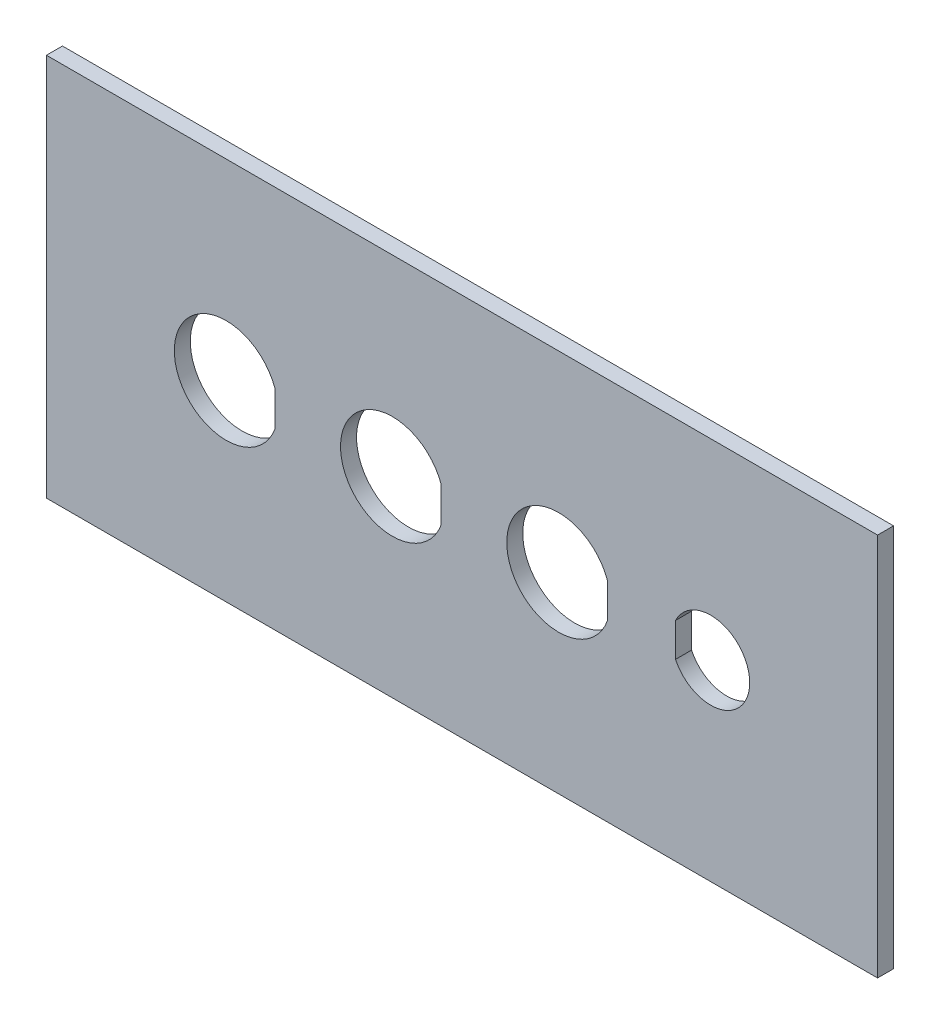
ISO-10303-21;
HEADER;
FILE_DESCRIPTION(('STEP AP214'),'2;1');
FILE_NAME('part.step','',(''),(''),'','','');
FILE_SCHEMA(('AUTOMOTIVE_DESIGN { 1 0 10303 214 1 1 1 1 }'));
ENDSEC;
DATA;
#1=APPLICATION_CONTEXT('core data for automotive mechanical design processes');
#2=APPLICATION_PROTOCOL_DEFINITION('international standard','automotive_design',2000,#1);
#3=PRODUCT_CONTEXT('',#1,'mechanical');
#4=PRODUCT('Part','Part','',(#3));
#5=PRODUCT_RELATED_PRODUCT_CATEGORY('part','',(#4));
#6=PRODUCT_DEFINITION_FORMATION('','',#4);
#7=PRODUCT_DEFINITION_CONTEXT('part definition',#1,'design');
#8=PRODUCT_DEFINITION('design','',#6,#7);
#9=PRODUCT_DEFINITION_SHAPE('','',#8);
#10=(LENGTH_UNIT() NAMED_UNIT(*) SI_UNIT(.MILLI.,.METRE.));
#11=(NAMED_UNIT(*) PLANE_ANGLE_UNIT() SI_UNIT($,.RADIAN.));
#12=(NAMED_UNIT(*) SI_UNIT($,.STERADIAN.) SOLID_ANGLE_UNIT());
#13=UNCERTAINTY_MEASURE_WITH_UNIT(LENGTH_MEASURE(1.E-05),#10,'distance_accuracy_value','');
#14=(GEOMETRIC_REPRESENTATION_CONTEXT(3) GLOBAL_UNCERTAINTY_ASSIGNED_CONTEXT((#13)) GLOBAL_UNIT_ASSIGNED_CONTEXT((#10,
#11,#12)) REPRESENTATION_CONTEXT('',''));
#15=CARTESIAN_POINT('',(0.,0.,0.));
#16=DIRECTION('',(0.,0.,1.));
#17=DIRECTION('',(1.,0.,0.));
#18=AXIS2_PLACEMENT_3D('',#15,#16,#17);
#19=CARTESIAN_POINT('',(0.,0.,3.175));
#20=DIRECTION('',(0.,0.,1.));
#21=DIRECTION('',(1.,0.,0.));
#22=AXIS2_PLACEMENT_3D('',#19,#20,#21);
#23=PLANE('',#22);
#24=DIRECTION('',(0.,1.,0.));
#25=VECTOR('',#24,1.);
#26=CARTESIAN_POINT('',(91.9011726957601,37.6066565431627,3.175));
#27=LINE('',#26,#25);
#28=CARTESIAN_POINT('',(91.9011726957601,-38.5933434568373,3.175));
#29=VERTEX_POINT('',#28);
#30=CARTESIAN_POINT('',(91.9011726957601,37.6066565431627,3.175));
#31=VERTEX_POINT('',#30);
#32=EDGE_CURVE('E241',#29,#31,#27,.T.);
#33=ORIENTED_EDGE('',*,*,#32,.T.);
#34=DIRECTION('',(-1.,0.,0.));
#35=VECTOR('',#34,1.);
#36=CARTESIAN_POINT('',(-73.1988273042399,37.6066565431627,3.175));
#37=LINE('',#36,#35);
#38=CARTESIAN_POINT('',(-73.1988273042399,37.6066565431627,3.175));
#39=VERTEX_POINT('',#38);
#40=EDGE_CURVE('E245',#31,#39,#37,.T.);
#41=ORIENTED_EDGE('',*,*,#40,.T.);
#42=DIRECTION('',(0.,-1.,0.));
#43=VECTOR('',#42,1.);
#44=CARTESIAN_POINT('',(-73.1988273042399,37.6066565431627,3.175));
#45=LINE('',#44,#43);
#46=CARTESIAN_POINT('',(-73.1988273042399,-38.5933434568373,3.175));
#47=VERTEX_POINT('',#46);
#48=EDGE_CURVE('E249',#39,#47,#45,.T.);
#49=ORIENTED_EDGE('',*,*,#48,.T.);
#50=DIRECTION('',(1.,0.,0.));
#51=VECTOR('',#50,1.);
#52=CARTESIAN_POINT('',(-73.1988273042399,-38.5933434568373,3.175));
#53=LINE('',#52,#51);
#54=EDGE_CURVE('E252',#47,#29,#53,.T.);
#55=ORIENTED_EDGE('',*,*,#54,.T.);
#56=EDGE_LOOP('',(#33,#41,#49,#55));
#57=FACE_BOUND('',#56,.T.);
#58=DIRECTION('',(0.,1.,0.));
#59=VECTOR('',#58,1.);
#60=CARTESIAN_POINT('',(-27.7988273042399,2.97075815830049,3.175));
#61=LINE('',#60,#59);
#62=CARTESIAN_POINT('',(-27.7988273042399,-3.95744507197501,3.175));
#63=VERTEX_POINT('',#62);
#64=CARTESIAN_POINT('',(-27.7988273042399,2.97075815830049,3.175));
#65=VERTEX_POINT('',#64);
#66=EDGE_CURVE('E222',#63,#65,#61,.T.);
#67=ORIENTED_EDGE('',*,*,#66,.F.);
#68=CARTESIAN_POINT('',(-37.4988273042399,-0.493343456837263,3.175));
#69=DIRECTION('',(0.,0.,1.));
#70=DIRECTION('',(1.,0.,0.));
#71=AXIS2_PLACEMENT_3D('',#68,#69,#70);
#72=CIRCLE('',#71,10.3);
#73=EDGE_CURVE('E219',#65,#63,#72,.T.);
#74=ORIENTED_EDGE('',*,*,#73,.F.);
#75=EDGE_LOOP('',(#67,#74));
#76=FACE_BOUND('',#75,.T.);
#77=DIRECTION('',(0.,-1.,0.));
#78=VECTOR('',#77,1.);
#79=CARTESIAN_POINT('',(51.7691726957601,2.85714665656408,3.175));
#80=LINE('',#79,#78);
#81=CARTESIAN_POINT('',(51.7691726957601,2.85714665656408,3.175));
#82=VERTEX_POINT('',#81);
#83=CARTESIAN_POINT('',(51.7691726957601,-3.84383357023861,3.175));
#84=VERTEX_POINT('',#83);
#85=EDGE_CURVE('E200',#82,#84,#80,.T.);
#86=ORIENTED_EDGE('',*,*,#85,.F.);
#87=CARTESIAN_POINT('',(58.7541726957601,-0.493343456837263,3.175));
#88=DIRECTION('',(0.,0.,1.));
#89=DIRECTION('',(1.,0.,0.));
#90=AXIS2_PLACEMENT_3D('',#87,#88,#89);
#91=CIRCLE('',#90,7.747);
#92=EDGE_CURVE('E196',#84,#82,#91,.T.);
#93=ORIENTED_EDGE('',*,*,#92,.F.);
#94=EDGE_LOOP('',(#86,#93));
#95=FACE_BOUND('',#94,.T.);
#96=DIRECTION('',(0.,1.,0.));
#97=VECTOR('',#96,1.);
#98=CARTESIAN_POINT('',(5.22117269576011,2.97075815830049,3.175));
#99=LINE('',#98,#97);
#100=CARTESIAN_POINT('',(5.22117269576011,-3.95744507197501,3.175));
#101=VERTEX_POINT('',#100);
#102=CARTESIAN_POINT('',(5.22117269576011,2.97075815830049,3.175));
#103=VERTEX_POINT('',#102);
#104=EDGE_CURVE('E177',#101,#103,#99,.T.);
#105=ORIENTED_EDGE('',*,*,#104,.F.);
#106=CARTESIAN_POINT('',(-4.47882730423989,-0.493343456837263,3.175));
#107=DIRECTION('',(0.,0.,1.));
#108=DIRECTION('',(1.,0.,0.));
#109=AXIS2_PLACEMENT_3D('',#106,#107,#108);
#110=CIRCLE('',#109,10.3);
#111=EDGE_CURVE('E173',#103,#101,#110,.T.);
#112=ORIENTED_EDGE('',*,*,#111,.F.);
#113=EDGE_LOOP('',(#105,#112));
#114=FACE_BOUND('',#113,.T.);
#115=DIRECTION('',(0.,1.,0.));
#116=VECTOR('',#115,1.);
#117=CARTESIAN_POINT('',(38.2411726957601,2.97075815830049,3.175));
#118=LINE('',#117,#116);
#119=CARTESIAN_POINT('',(38.2411726957601,-3.95744507197501,3.175));
#120=VERTEX_POINT('',#119);
#121=CARTESIAN_POINT('',(38.2411726957601,2.97075815830049,3.175));
#122=VERTEX_POINT('',#121);
#123=EDGE_CURVE('E149',#120,#122,#118,.T.);
#124=ORIENTED_EDGE('',*,*,#123,.F.);
#125=CARTESIAN_POINT('',(28.5411726957601,-0.493343456837263,3.175));
#126=DIRECTION('',(0.,0.,1.));
#127=DIRECTION('',(1.,0.,0.));
#128=AXIS2_PLACEMENT_3D('',#125,#126,#127);
#129=CIRCLE('',#128,10.3);
#130=EDGE_CURVE('E156',#122,#120,#129,.T.);
#131=ORIENTED_EDGE('',*,*,#130,.F.);
#132=EDGE_LOOP('',(#124,#131));
#133=FACE_BOUND('',#132,.T.);
#134=ADVANCED_FACE('F43',(#57,#76,#95,#114,#133),#23,.T.);
#135=CARTESIAN_POINT('',(0.,0.,0.));
#136=DIRECTION('',(0.,0.,1.));
#137=DIRECTION('',(1.,0.,0.));
#138=AXIS2_PLACEMENT_3D('',#135,#136,#137);
#139=PLANE('',#138);
#140=CARTESIAN_POINT('',(-4.47882730423989,-0.493343456837263,0.));
#141=DIRECTION('',(0.,0.,1.));
#142=DIRECTION('',(1.,0.,0.));
#143=AXIS2_PLACEMENT_3D('',#140,#141,#142);
#144=CIRCLE('',#143,10.3);
#145=CARTESIAN_POINT('',(5.22117269576011,2.97075815830049,0.));
#146=VERTEX_POINT('',#145);
#147=CARTESIAN_POINT('',(5.22117269576011,-3.95744507197501,0.));
#148=VERTEX_POINT('',#147);
#149=EDGE_CURVE('E172',#146,#148,#144,.T.);
#150=ORIENTED_EDGE('',*,*,#149,.T.);
#151=DIRECTION('',(0.,1.,0.));
#152=VECTOR('',#151,1.);
#153=CARTESIAN_POINT('',(5.22117269576011,2.97075815830049,0.));
#154=LINE('',#153,#152);
#155=EDGE_CURVE('E178',#148,#146,#154,.T.);
#156=ORIENTED_EDGE('',*,*,#155,.T.);
#157=EDGE_LOOP('',(#150,#156));
#158=FACE_BOUND('',#157,.T.);
#159=CARTESIAN_POINT('',(-37.4988273042399,-0.493343456837263,0.));
#160=DIRECTION('',(0.,0.,1.));
#161=DIRECTION('',(1.,0.,0.));
#162=AXIS2_PLACEMENT_3D('',#159,#160,#161);
#163=CIRCLE('',#162,10.3);
#164=CARTESIAN_POINT('',(-27.7988273042399,2.97075815830049,0.));
#165=VERTEX_POINT('',#164);
#166=CARTESIAN_POINT('',(-27.7988273042399,-3.95744507197501,0.));
#167=VERTEX_POINT('',#166);
#168=EDGE_CURVE('E218',#165,#167,#163,.T.);
#169=ORIENTED_EDGE('',*,*,#168,.T.);
#170=DIRECTION('',(0.,1.,0.));
#171=VECTOR('',#170,1.);
#172=CARTESIAN_POINT('',(-27.7988273042399,2.97075815830049,0.));
#173=LINE('',#172,#171);
#174=EDGE_CURVE('E223',#167,#165,#173,.T.);
#175=ORIENTED_EDGE('',*,*,#174,.T.);
#176=EDGE_LOOP('',(#169,#175));
#177=FACE_BOUND('',#176,.T.);
#178=DIRECTION('',(0.,1.,0.));
#179=VECTOR('',#178,1.);
#180=CARTESIAN_POINT('',(91.9011726957601,37.6066565431627,0.));
#181=LINE('',#180,#179);
#182=CARTESIAN_POINT('',(91.9011726957601,-38.5933434568373,0.));
#183=VERTEX_POINT('',#182);
#184=CARTESIAN_POINT('',(91.9011726957601,37.6066565431627,0.));
#185=VERTEX_POINT('',#184);
#186=EDGE_CURVE('E240',#183,#185,#181,.T.);
#187=ORIENTED_EDGE('',*,*,#186,.F.);
#188=DIRECTION('',(1.,0.,0.));
#189=VECTOR('',#188,1.);
#190=CARTESIAN_POINT('',(-73.1988273042399,-38.5933434568373,0.));
#191=LINE('',#190,#189);
#192=CARTESIAN_POINT('',(-73.1988273042399,-38.5933434568373,0.));
#193=VERTEX_POINT('',#192);
#194=EDGE_CURVE('E246',#193,#183,#191,.T.);
#195=ORIENTED_EDGE('',*,*,#194,.F.);
#196=DIRECTION('',(0.,-1.,0.));
#197=VECTOR('',#196,1.);
#198=CARTESIAN_POINT('',(-73.1988273042399,37.6066565431627,0.));
#199=LINE('',#198,#197);
#200=CARTESIAN_POINT('',(-73.1988273042399,37.6066565431627,0.));
#201=VERTEX_POINT('',#200);
#202=EDGE_CURVE('E262',#201,#193,#199,.T.);
#203=ORIENTED_EDGE('',*,*,#202,.F.);
#204=DIRECTION('',(-1.,0.,0.));
#205=VECTOR('',#204,1.);
#206=CARTESIAN_POINT('',(-73.1988273042399,37.6066565431627,0.));
#207=LINE('',#206,#205);
#208=EDGE_CURVE('E259',#185,#201,#207,.T.);
#209=ORIENTED_EDGE('',*,*,#208,.F.);
#210=EDGE_LOOP('',(#187,#195,#203,#209));
#211=FACE_BOUND('',#210,.T.);
#212=CARTESIAN_POINT('',(58.7541726957601,-0.493343456837263,0.));
#213=DIRECTION('',(0.,0.,1.));
#214=DIRECTION('',(1.,0.,0.));
#215=AXIS2_PLACEMENT_3D('',#212,#213,#214);
#216=CIRCLE('',#215,7.747);
#217=CARTESIAN_POINT('',(51.7691726957601,-3.84383357023861,0.));
#218=VERTEX_POINT('',#217);
#219=CARTESIAN_POINT('',(51.7691726957601,2.85714665656408,0.));
#220=VERTEX_POINT('',#219);
#221=EDGE_CURVE('E195',#218,#220,#216,.T.);
#222=ORIENTED_EDGE('',*,*,#221,.T.);
#223=DIRECTION('',(0.,-1.,0.));
#224=VECTOR('',#223,1.);
#225=CARTESIAN_POINT('',(51.7691726957601,2.85714665656408,0.));
#226=LINE('',#225,#224);
#227=EDGE_CURVE('E201',#220,#218,#226,.T.);
#228=ORIENTED_EDGE('',*,*,#227,.T.);
#229=EDGE_LOOP('',(#222,#228));
#230=FACE_BOUND('',#229,.T.);
#231=CARTESIAN_POINT('',(28.5411726957601,-0.493343456837263,0.));
#232=DIRECTION('',(0.,0.,1.));
#233=DIRECTION('',(1.,0.,0.));
#234=AXIS2_PLACEMENT_3D('',#231,#232,#233);
#235=CIRCLE('',#234,10.3);
#236=CARTESIAN_POINT('',(38.2411726957601,2.97075815830049,0.));
#237=VERTEX_POINT('',#236);
#238=CARTESIAN_POINT('',(38.2411726957601,-3.95744507197501,0.));
#239=VERTEX_POINT('',#238);
#240=EDGE_CURVE('E71',#237,#239,#235,.T.);
#241=ORIENTED_EDGE('',*,*,#240,.T.);
#242=DIRECTION('',(0.,1.,0.));
#243=VECTOR('',#242,1.);
#244=CARTESIAN_POINT('',(38.2411726957601,2.97075815830049,0.));
#245=LINE('',#244,#243);
#246=EDGE_CURVE('E162',#239,#237,#245,.T.);
#247=ORIENTED_EDGE('',*,*,#246,.T.);
#248=EDGE_LOOP('',(#241,#247));
#249=FACE_BOUND('',#248,.T.);
#250=ADVANCED_FACE('F283',(#158,#177,#211,#230,#249),#139,.F.);
#251=CARTESIAN_POINT('',(91.9011726957601,37.6066565431627,3.175));
#252=DIRECTION('',(-1.,0.,0.));
#253=DIRECTION('',(0.,0.,1.));
#254=AXIS2_PLACEMENT_3D('',#251,#252,#253);
#255=PLANE('',#254);
#256=ORIENTED_EDGE('',*,*,#186,.T.);
#257=DIRECTION('',(0.,0.,-1.));
#258=VECTOR('',#257,1.);
#259=CARTESIAN_POINT('',(91.9011726957601,37.6066565431627,3.175));
#260=LINE('',#259,#258);
#261=EDGE_CURVE('E11',#31,#185,#260,.T.);
#262=ORIENTED_EDGE('',*,*,#261,.F.);
#263=ORIENTED_EDGE('',*,*,#32,.F.);
#264=DIRECTION('',(0.,0.,-1.));
#265=VECTOR('',#264,1.);
#266=CARTESIAN_POINT('',(91.9011726957601,-38.5933434568373,3.175));
#267=LINE('',#266,#265);
#268=EDGE_CURVE('E255',#29,#183,#267,.T.);
#269=ORIENTED_EDGE('',*,*,#268,.T.);
#270=EDGE_LOOP('',(#256,#262,#263,#269));
#271=FACE_BOUND('',#270,.T.);
#272=ADVANCED_FACE('F45',(#271),#255,.F.);
#273=CARTESIAN_POINT('',(-73.1988273042399,37.6066565431627,3.175));
#274=DIRECTION('',(0.,-1.,0.));
#275=DIRECTION('',(0.,0.,-1.));
#276=AXIS2_PLACEMENT_3D('',#273,#274,#275);
#277=PLANE('',#276);
#278=ORIENTED_EDGE('',*,*,#208,.T.);
#279=DIRECTION('',(0.,0.,-1.));
#280=VECTOR('',#279,1.);
#281=CARTESIAN_POINT('',(-73.1988273042399,37.6066565431627,3.175));
#282=LINE('',#281,#280);
#283=EDGE_CURVE('E51',#39,#201,#282,.T.);
#284=ORIENTED_EDGE('',*,*,#283,.F.);
#285=ORIENTED_EDGE('',*,*,#40,.F.);
#286=ORIENTED_EDGE('',*,*,#261,.T.);
#287=EDGE_LOOP('',(#278,#284,#285,#286));
#288=FACE_BOUND('',#287,.T.);
#289=ADVANCED_FACE('F294',(#288),#277,.F.);
#290=CARTESIAN_POINT('',(-73.1988273042399,37.6066565431627,3.175));
#291=DIRECTION('',(1.,0.,0.));
#292=DIRECTION('',(0.,0.,-1.));
#293=AXIS2_PLACEMENT_3D('',#290,#291,#292);
#294=PLANE('',#293);
#295=ORIENTED_EDGE('',*,*,#202,.T.);
#296=DIRECTION('',(0.,0.,-1.));
#297=VECTOR('',#296,1.);
#298=CARTESIAN_POINT('',(-73.1988273042399,-38.5933434568373,3.175));
#299=LINE('',#298,#297);
#300=EDGE_CURVE('E269',#47,#193,#299,.T.);
#301=ORIENTED_EDGE('',*,*,#300,.F.);
#302=ORIENTED_EDGE('',*,*,#48,.F.);
#303=ORIENTED_EDGE('',*,*,#283,.T.);
#304=EDGE_LOOP('',(#295,#301,#302,#303));
#305=FACE_BOUND('',#304,.T.);
#306=ADVANCED_FACE('F277',(#305),#294,.F.);
#307=CARTESIAN_POINT('',(-73.1988273042399,-38.5933434568373,3.175));
#308=DIRECTION('',(0.,1.,0.));
#309=DIRECTION('',(0.,0.,1.));
#310=AXIS2_PLACEMENT_3D('',#307,#308,#309);
#311=PLANE('',#310);
#312=ORIENTED_EDGE('',*,*,#194,.T.);
#313=ORIENTED_EDGE('',*,*,#268,.F.);
#314=ORIENTED_EDGE('',*,*,#54,.F.);
#315=ORIENTED_EDGE('',*,*,#300,.T.);
#316=EDGE_LOOP('',(#312,#313,#314,#315));
#317=FACE_BOUND('',#316,.T.);
#318=ADVANCED_FACE('F287',(#317),#311,.F.);
#319=CARTESIAN_POINT('',(-37.4988273042399,-0.493343456837263,3.175));
#320=DIRECTION('',(0.,0.,-1.));
#321=DIRECTION('',(-1.,0.,0.));
#322=AXIS2_PLACEMENT_3D('',#319,#320,#321);
#323=CYLINDRICAL_SURFACE('',#322,10.3);
#324=ORIENTED_EDGE('',*,*,#168,.F.);
#325=DIRECTION('',(0.,0.,-1.));
#326=VECTOR('',#325,1.);
#327=CARTESIAN_POINT('',(-27.7988273042399,2.97075815830049,3.175));
#328=LINE('',#327,#326);
#329=EDGE_CURVE('E226',#65,#165,#328,.T.);
#330=ORIENTED_EDGE('',*,*,#329,.F.);
#331=ORIENTED_EDGE('',*,*,#73,.T.);
#332=DIRECTION('',(0.,0.,-1.));
#333=VECTOR('',#332,1.);
#334=CARTESIAN_POINT('',(-27.7988273042399,-3.95744507197501,3.175));
#335=LINE('',#334,#333);
#336=EDGE_CURVE('E236',#63,#167,#335,.T.);
#337=ORIENTED_EDGE('',*,*,#336,.T.);
#338=EDGE_LOOP('',(#324,#330,#331,#337));
#339=FACE_BOUND('',#338,.T.);
#340=ADVANCED_FACE('F309',(#339),#323,.F.);
#341=CARTESIAN_POINT('',(-27.7988273042399,2.97075815830049,3.175));
#342=DIRECTION('',(-1.,0.,0.));
#343=DIRECTION('',(0.,0.,1.));
#344=AXIS2_PLACEMENT_3D('',#341,#342,#343);
#345=PLANE('',#344);
#346=ORIENTED_EDGE('',*,*,#174,.F.);
#347=ORIENTED_EDGE('',*,*,#336,.F.);
#348=ORIENTED_EDGE('',*,*,#66,.T.);
#349=ORIENTED_EDGE('',*,*,#329,.T.);
#350=EDGE_LOOP('',(#346,#347,#348,#349));
#351=FACE_BOUND('',#350,.T.);
#352=ADVANCED_FACE('F316',(#351),#345,.T.);
#353=CARTESIAN_POINT('',(58.7541726957601,-0.493343456837263,3.175));
#354=DIRECTION('',(0.,0.,-1.));
#355=DIRECTION('',(-1.,0.,0.));
#356=AXIS2_PLACEMENT_3D('',#353,#354,#355);
#357=CYLINDRICAL_SURFACE('',#356,7.747);
#358=ORIENTED_EDGE('',*,*,#221,.F.);
#359=DIRECTION('',(0.,0.,-1.));
#360=VECTOR('',#359,1.);
#361=CARTESIAN_POINT('',(51.7691726957601,-3.84383357023861,3.175));
#362=LINE('',#361,#360);
#363=EDGE_CURVE('E204',#84,#218,#362,.T.);
#364=ORIENTED_EDGE('',*,*,#363,.F.);
#365=ORIENTED_EDGE('',*,*,#92,.T.);
#366=DIRECTION('',(0.,0.,-1.));
#367=VECTOR('',#366,1.);
#368=CARTESIAN_POINT('',(51.7691726957601,2.85714665656408,3.175));
#369=LINE('',#368,#367);
#370=EDGE_CURVE('E214',#82,#220,#369,.T.);
#371=ORIENTED_EDGE('',*,*,#370,.T.);
#372=EDGE_LOOP('',(#358,#364,#365,#371));
#373=FACE_BOUND('',#372,.T.);
#374=ADVANCED_FACE('F321',(#373),#357,.F.);
#375=CARTESIAN_POINT('',(51.7691726957601,2.85714665656408,3.175));
#376=DIRECTION('',(1.,0.,0.));
#377=DIRECTION('',(0.,0.,-1.));
#378=AXIS2_PLACEMENT_3D('',#375,#376,#377);
#379=PLANE('',#378);
#380=ORIENTED_EDGE('',*,*,#227,.F.);
#381=ORIENTED_EDGE('',*,*,#370,.F.);
#382=ORIENTED_EDGE('',*,*,#85,.T.);
#383=ORIENTED_EDGE('',*,*,#363,.T.);
#384=EDGE_LOOP('',(#380,#381,#382,#383));
#385=FACE_BOUND('',#384,.T.);
#386=ADVANCED_FACE('F339',(#385),#379,.T.);
#387=CARTESIAN_POINT('',(-4.47882730423989,-0.493343456837263,3.175));
#388=DIRECTION('',(0.,0.,-1.));
#389=DIRECTION('',(-1.,0.,0.));
#390=AXIS2_PLACEMENT_3D('',#387,#388,#389);
#391=CYLINDRICAL_SURFACE('',#390,10.3);
#392=ORIENTED_EDGE('',*,*,#149,.F.);
#393=DIRECTION('',(0.,0.,-1.));
#394=VECTOR('',#393,1.);
#395=CARTESIAN_POINT('',(5.22117269576011,2.97075815830049,3.175));
#396=LINE('',#395,#394);
#397=EDGE_CURVE('E181',#103,#146,#396,.T.);
#398=ORIENTED_EDGE('',*,*,#397,.F.);
#399=ORIENTED_EDGE('',*,*,#111,.T.);
#400=DIRECTION('',(0.,0.,-1.));
#401=VECTOR('',#400,1.);
#402=CARTESIAN_POINT('',(5.22117269576011,-3.95744507197501,3.175));
#403=LINE('',#402,#401);
#404=EDGE_CURVE('E191',#101,#148,#403,.T.);
#405=ORIENTED_EDGE('',*,*,#404,.T.);
#406=EDGE_LOOP('',(#392,#398,#399,#405));
#407=FACE_BOUND('',#406,.T.);
#408=ADVANCED_FACE('F337',(#407),#391,.F.);
#409=CARTESIAN_POINT('',(5.22117269576011,2.97075815830049,3.175));
#410=DIRECTION('',(-1.,0.,0.));
#411=DIRECTION('',(0.,0.,1.));
#412=AXIS2_PLACEMENT_3D('',#409,#410,#411);
#413=PLANE('',#412);
#414=ORIENTED_EDGE('',*,*,#155,.F.);
#415=ORIENTED_EDGE('',*,*,#404,.F.);
#416=ORIENTED_EDGE('',*,*,#104,.T.);
#417=ORIENTED_EDGE('',*,*,#397,.T.);
#418=EDGE_LOOP('',(#414,#415,#416,#417));
#419=FACE_BOUND('',#418,.T.);
#420=ADVANCED_FACE('F335',(#419),#413,.T.);
#421=CARTESIAN_POINT('',(28.5411726957601,-0.493343456837263,3.175));
#422=DIRECTION('',(0.,0.,-1.));
#423=DIRECTION('',(-1.,0.,0.));
#424=AXIS2_PLACEMENT_3D('',#421,#422,#423);
#425=CYLINDRICAL_SURFACE('',#424,10.3);
#426=ORIENTED_EDGE('',*,*,#240,.F.);
#427=DIRECTION('',(0.,0.,-1.));
#428=VECTOR('',#427,1.);
#429=CARTESIAN_POINT('',(38.2411726957601,2.97075815830049,3.175));
#430=LINE('',#429,#428);
#431=EDGE_CURVE('E151',#122,#237,#430,.T.);
#432=ORIENTED_EDGE('',*,*,#431,.F.);
#433=ORIENTED_EDGE('',*,*,#130,.T.);
#434=DIRECTION('',(0.,0.,-1.));
#435=VECTOR('',#434,1.);
#436=CARTESIAN_POINT('',(38.2411726957601,-3.95744507197501,3.175));
#437=LINE('',#436,#435);
#438=EDGE_CURVE('E61',#120,#239,#437,.T.);
#439=ORIENTED_EDGE('',*,*,#438,.T.);
#440=EDGE_LOOP('',(#426,#432,#433,#439));
#441=FACE_BOUND('',#440,.T.);
#442=ADVANCED_FACE('F158',(#441),#425,.F.);
#443=CARTESIAN_POINT('',(38.2411726957601,2.97075815830049,3.175));
#444=DIRECTION('',(-1.,0.,0.));
#445=DIRECTION('',(0.,0.,1.));
#446=AXIS2_PLACEMENT_3D('',#443,#444,#445);
#447=PLANE('',#446);
#448=ORIENTED_EDGE('',*,*,#246,.F.);
#449=ORIENTED_EDGE('',*,*,#438,.F.);
#450=ORIENTED_EDGE('',*,*,#123,.T.);
#451=ORIENTED_EDGE('',*,*,#431,.T.);
#452=EDGE_LOOP('',(#448,#449,#450,#451));
#453=FACE_BOUND('',#452,.T.);
#454=ADVANCED_FACE('F150',(#453),#447,.T.);
#455=CLOSED_SHELL('',(#134,#250,#272,#289,#306,#318,#340,#352,#374,#386,#408,#420,#442,#454));
#456=MANIFOLD_SOLID_BREP('B2',#455);
#457=ADVANCED_BREP_SHAPE_REPRESENTATION('',(#18,#456),#14);
#458=SHAPE_DEFINITION_REPRESENTATION(#9,#457);
ENDSEC;
END-ISO-10303-21;
